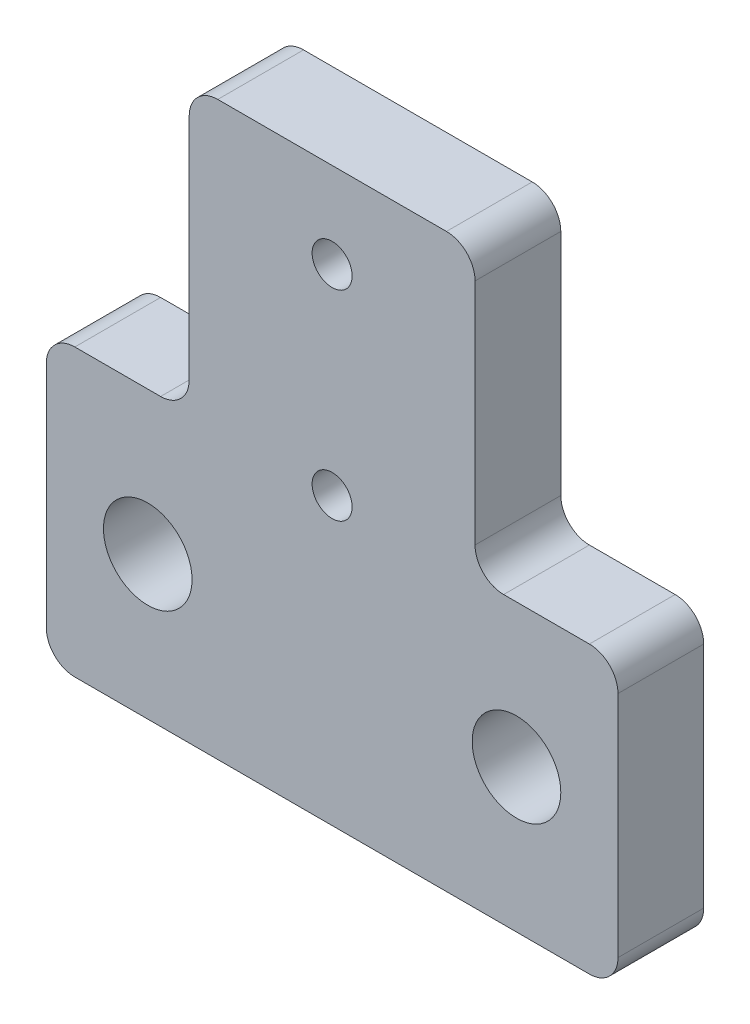
ISO-10303-21;
HEADER;
FILE_DESCRIPTION(('STEP AP214'),'2;1');
FILE_NAME('part.step','',(''),(''),'','','');
FILE_SCHEMA(('AUTOMOTIVE_DESIGN { 1 0 10303 214 1 1 1 1 }'));
ENDSEC;
DATA;
#1=APPLICATION_CONTEXT('core data for automotive mechanical design processes');
#2=APPLICATION_PROTOCOL_DEFINITION('international standard','automotive_design',2000,#1);
#3=PRODUCT_CONTEXT('',#1,'mechanical');
#4=PRODUCT('Part','Part','',(#3));
#5=PRODUCT_RELATED_PRODUCT_CATEGORY('part','',(#4));
#6=PRODUCT_DEFINITION_FORMATION('','',#4);
#7=PRODUCT_DEFINITION_CONTEXT('part definition',#1,'design');
#8=PRODUCT_DEFINITION('design','',#6,#7);
#9=PRODUCT_DEFINITION_SHAPE('','',#8);
#10=(LENGTH_UNIT() NAMED_UNIT(*) SI_UNIT(.MILLI.,.METRE.));
#11=(NAMED_UNIT(*) PLANE_ANGLE_UNIT() SI_UNIT($,.RADIAN.));
#12=(NAMED_UNIT(*) SI_UNIT($,.STERADIAN.) SOLID_ANGLE_UNIT());
#13=UNCERTAINTY_MEASURE_WITH_UNIT(LENGTH_MEASURE(1.E-05),#10,'distance_accuracy_value','');
#14=(GEOMETRIC_REPRESENTATION_CONTEXT(3) GLOBAL_UNCERTAINTY_ASSIGNED_CONTEXT((#13)) GLOBAL_UNIT_ASSIGNED_CONTEXT((#10,
#11,#12)) REPRESENTATION_CONTEXT('',''));
#15=CARTESIAN_POINT('',(0.,0.,0.));
#16=DIRECTION('',(0.,0.,1.));
#17=DIRECTION('',(1.,0.,0.));
#18=AXIS2_PLACEMENT_3D('',#15,#16,#17);
#19=CARTESIAN_POINT('',(0.,0.,3.));
#20=DIRECTION('',(0.,0.,-1.));
#21=DIRECTION('',(-1.,0.,0.));
#22=AXIS2_PLACEMENT_3D('',#19,#20,#21);
#23=PLANE('',#22);
#24=DIRECTION('',(0.,1.,0.));
#25=VECTOR('',#24,1.);
#26=CARTESIAN_POINT('',(10.,0.,3.));
#27=LINE('',#26,#25);
#28=CARTESIAN_POINT('',(10.,-9.,3.));
#29=VERTEX_POINT('',#28);
#30=CARTESIAN_POINT('',(10.,-1.,3.));
#31=VERTEX_POINT('',#30);
#32=EDGE_CURVE('E320',#29,#31,#27,.T.);
#33=ORIENTED_EDGE('',*,*,#32,.T.);
#34=CARTESIAN_POINT('',(9.,-1.,3.));
#35=DIRECTION('',(0.,0.,-1.));
#36=DIRECTION('',(-1.,0.,0.));
#37=AXIS2_PLACEMENT_3D('',#34,#35,#36);
#38=CIRCLE('',#37,1.);
#39=CARTESIAN_POINT('',(9.,0.,3.));
#40=VERTEX_POINT('',#39);
#41=EDGE_CURVE('E260',#31,#40,#38,.F.);
#42=ORIENTED_EDGE('',*,*,#41,.T.);
#43=DIRECTION('',(-1.,0.,0.));
#44=VECTOR('',#43,1.);
#45=CARTESIAN_POINT('',(5.,0.,3.));
#46=LINE('',#45,#44);
#47=CARTESIAN_POINT('',(6.,0.,3.));
#48=VERTEX_POINT('',#47);
#49=EDGE_CURVE('E308',#40,#48,#46,.T.);
#50=ORIENTED_EDGE('',*,*,#49,.T.);
#51=CARTESIAN_POINT('',(6.,0.999999999999997,3.));
#52=DIRECTION('',(0.,0.,-1.));
#53=DIRECTION('',(-1.,0.,0.));
#54=AXIS2_PLACEMENT_3D('',#51,#52,#53);
#55=CIRCLE('',#54,1.);
#56=CARTESIAN_POINT('',(5.,0.999999999999997,3.));
#57=VERTEX_POINT('',#56);
#58=EDGE_CURVE('E11',#48,#57,#55,.T.);
#59=ORIENTED_EDGE('',*,*,#58,.T.);
#60=DIRECTION('',(0.,1.,0.));
#61=VECTOR('',#60,1.);
#62=CARTESIAN_POINT('',(5.,10.,3.));
#63=LINE('',#62,#61);
#64=CARTESIAN_POINT('',(5.,9.,3.));
#65=VERTEX_POINT('',#64);
#66=EDGE_CURVE('E306',#57,#65,#63,.T.);
#67=ORIENTED_EDGE('',*,*,#66,.T.);
#68=CARTESIAN_POINT('',(4.,9.,3.));
#69=DIRECTION('',(0.,0.,-1.));
#70=DIRECTION('',(-1.,0.,0.));
#71=AXIS2_PLACEMENT_3D('',#68,#69,#70);
#72=CIRCLE('',#71,1.);
#73=CARTESIAN_POINT('',(4.,10.,3.));
#74=VERTEX_POINT('',#73);
#75=EDGE_CURVE('E249',#65,#74,#72,.F.);
#76=ORIENTED_EDGE('',*,*,#75,.T.);
#77=DIRECTION('',(-1.,0.,0.));
#78=VECTOR('',#77,1.);
#79=CARTESIAN_POINT('',(-5.,10.,3.));
#80=LINE('',#79,#78);
#81=CARTESIAN_POINT('',(-4.,10.,3.));
#82=VERTEX_POINT('',#81);
#83=EDGE_CURVE('E313',#74,#82,#80,.T.);
#84=ORIENTED_EDGE('',*,*,#83,.T.);
#85=CARTESIAN_POINT('',(-4.,9.,3.));
#86=DIRECTION('',(0.,0.,-1.));
#87=DIRECTION('',(-1.,0.,0.));
#88=AXIS2_PLACEMENT_3D('',#85,#86,#87);
#89=CIRCLE('',#88,1.);
#90=CARTESIAN_POINT('',(-5.,9.,3.));
#91=VERTEX_POINT('',#90);
#92=EDGE_CURVE('E246',#82,#91,#89,.F.);
#93=ORIENTED_EDGE('',*,*,#92,.T.);
#94=DIRECTION('',(0.,-1.,0.));
#95=VECTOR('',#94,1.);
#96=CARTESIAN_POINT('',(-5.,10.,3.));
#97=LINE('',#96,#95);
#98=CARTESIAN_POINT('',(-5.,0.999999999999997,3.));
#99=VERTEX_POINT('',#98);
#100=EDGE_CURVE('E318',#91,#99,#97,.T.);
#101=ORIENTED_EDGE('',*,*,#100,.T.);
#102=CARTESIAN_POINT('',(-6.,0.999999999999998,3.));
#103=DIRECTION('',(0.,0.,-1.));
#104=DIRECTION('',(-1.,0.,0.));
#105=AXIS2_PLACEMENT_3D('',#102,#103,#104);
#106=CIRCLE('',#105,1.);
#107=CARTESIAN_POINT('',(-6.,0.,3.));
#108=VERTEX_POINT('',#107);
#109=EDGE_CURVE('E165',#99,#108,#106,.T.);
#110=ORIENTED_EDGE('',*,*,#109,.T.);
#111=DIRECTION('',(-1.,0.,0.));
#112=VECTOR('',#111,1.);
#113=CARTESIAN_POINT('',(-5.,0.,3.));
#114=LINE('',#113,#112);
#115=CARTESIAN_POINT('',(-9.,0.,3.));
#116=VERTEX_POINT('',#115);
#117=EDGE_CURVE('E174',#108,#116,#114,.T.);
#118=ORIENTED_EDGE('',*,*,#117,.T.);
#119=CARTESIAN_POINT('',(-9.,-1.,3.));
#120=DIRECTION('',(0.,0.,-1.));
#121=DIRECTION('',(-1.,0.,0.));
#122=AXIS2_PLACEMENT_3D('',#119,#120,#121);
#123=CIRCLE('',#122,1.);
#124=CARTESIAN_POINT('',(-10.,-1.,3.));
#125=VERTEX_POINT('',#124);
#126=EDGE_CURVE('E62',#116,#125,#123,.F.);
#127=ORIENTED_EDGE('',*,*,#126,.T.);
#128=DIRECTION('',(0.,-1.,0.));
#129=VECTOR('',#128,1.);
#130=CARTESIAN_POINT('',(-10.,0.,3.));
#131=LINE('',#130,#129);
#132=CARTESIAN_POINT('',(-10.,-9.,3.));
#133=VERTEX_POINT('',#132);
#134=EDGE_CURVE('E201',#125,#133,#131,.T.);
#135=ORIENTED_EDGE('',*,*,#134,.T.);
#136=CARTESIAN_POINT('',(-9.,-9.,3.));
#137=DIRECTION('',(0.,0.,-1.));
#138=DIRECTION('',(-1.,0.,0.));
#139=AXIS2_PLACEMENT_3D('',#136,#137,#138);
#140=CIRCLE('',#139,1.);
#141=CARTESIAN_POINT('',(-9.,-10.,3.));
#142=VERTEX_POINT('',#141);
#143=EDGE_CURVE('E254',#133,#142,#140,.F.);
#144=ORIENTED_EDGE('',*,*,#143,.T.);
#145=DIRECTION('',(1.,0.,0.));
#146=VECTOR('',#145,1.);
#147=CARTESIAN_POINT('',(5.,-10.,3.));
#148=LINE('',#147,#146);
#149=CARTESIAN_POINT('',(9.,-10.,3.));
#150=VERTEX_POINT('',#149);
#151=EDGE_CURVE('E199',#142,#150,#148,.T.);
#152=ORIENTED_EDGE('',*,*,#151,.T.);
#153=CARTESIAN_POINT('',(9.,-9.,3.));
#154=DIRECTION('',(0.,0.,-1.));
#155=DIRECTION('',(-1.,0.,0.));
#156=AXIS2_PLACEMENT_3D('',#153,#154,#155);
#157=CIRCLE('',#156,1.);
#158=EDGE_CURVE('E257',#150,#29,#157,.F.);
#159=ORIENTED_EDGE('',*,*,#158,.T.);
#160=EDGE_LOOP('',(#33,#42,#50,#59,#67,#76,#84,#93,#101,#110,#118,#127,#135,#144,#152,#159));
#161=FACE_BOUND('',#160,.T.);
#162=CARTESIAN_POINT('',(-6.45,-5.,3.));
#163=DIRECTION('',(0.,0.,1.));
#164=DIRECTION('',(1.,0.,0.));
#165=AXIS2_PLACEMENT_3D('',#162,#163,#164);
#166=CIRCLE('',#165,1.55);
#167=CARTESIAN_POINT('',(-4.9,-5.,3.));
#168=VERTEX_POINT('',#167);
#169=EDGE_CURVE('E333',#168,#168,#166,.T.);
#170=ORIENTED_EDGE('',*,*,#169,.F.);
#171=EDGE_LOOP('',(#170));
#172=FACE_BOUND('',#171,.T.);
#173=CARTESIAN_POINT('',(6.44999999999999,-5.,3.));
#174=DIRECTION('',(0.,0.,1.));
#175=DIRECTION('',(1.,0.,0.));
#176=AXIS2_PLACEMENT_3D('',#173,#174,#175);
#177=CIRCLE('',#176,1.55);
#178=CARTESIAN_POINT('',(7.99999999999999,-5.,3.));
#179=VERTEX_POINT('',#178);
#180=EDGE_CURVE('E396',#179,#179,#177,.T.);
#181=ORIENTED_EDGE('',*,*,#180,.F.);
#182=EDGE_LOOP('',(#181));
#183=FACE_BOUND('',#182,.T.);
#184=CARTESIAN_POINT('',(0.,0.,3.));
#185=DIRECTION('',(0.,0.,1.));
#186=DIRECTION('',(1.,0.,0.));
#187=AXIS2_PLACEMENT_3D('',#184,#185,#186);
#188=CIRCLE('',#187,0.7);
#189=CARTESIAN_POINT('',(0.700000000000001,0.,3.));
#190=VERTEX_POINT('',#189);
#191=EDGE_CURVE('E404',#190,#190,#188,.T.);
#192=ORIENTED_EDGE('',*,*,#191,.F.);
#193=EDGE_LOOP('',(#192));
#194=FACE_BOUND('',#193,.T.);
#195=CARTESIAN_POINT('',(0.,7.,3.));
#196=DIRECTION('',(0.,0.,1.));
#197=DIRECTION('',(1.,0.,0.));
#198=AXIS2_PLACEMENT_3D('',#195,#196,#197);
#199=CIRCLE('',#198,0.7);
#200=CARTESIAN_POINT('',(0.7,7.,3.));
#201=VERTEX_POINT('',#200);
#202=EDGE_CURVE('E412',#201,#201,#199,.T.);
#203=ORIENTED_EDGE('',*,*,#202,.F.);
#204=EDGE_LOOP('',(#203));
#205=FACE_BOUND('',#204,.T.);
#206=ADVANCED_FACE('F39',(#161,#172,#183,#194,#205),#23,.F.);
#207=CARTESIAN_POINT('',(0.,0.,0.));
#208=DIRECTION('',(0.,0.,-1.));
#209=DIRECTION('',(-1.,0.,0.));
#210=AXIS2_PLACEMENT_3D('',#207,#208,#209);
#211=PLANE('',#210);
#212=CARTESIAN_POINT('',(0.,0.,0.));
#213=DIRECTION('',(0.,0.,1.));
#214=DIRECTION('',(1.,0.,0.));
#215=AXIS2_PLACEMENT_3D('',#212,#213,#214);
#216=CIRCLE('',#215,0.7);
#217=CARTESIAN_POINT('',(0.700000000000001,0.,0.));
#218=VERTEX_POINT('',#217);
#219=EDGE_CURVE('E408',#218,#218,#216,.T.);
#220=ORIENTED_EDGE('',*,*,#219,.T.);
#221=EDGE_LOOP('',(#220));
#222=FACE_BOUND('',#221,.T.);
#223=CARTESIAN_POINT('',(-6.45,-5.,0.));
#224=DIRECTION('',(0.,0.,1.));
#225=DIRECTION('',(1.,0.,0.));
#226=AXIS2_PLACEMENT_3D('',#223,#224,#225);
#227=CIRCLE('',#226,1.55);
#228=CARTESIAN_POINT('',(-4.9,-5.,0.));
#229=VERTEX_POINT('',#228);
#230=EDGE_CURVE('E392',#229,#229,#227,.T.);
#231=ORIENTED_EDGE('',*,*,#230,.T.);
#232=EDGE_LOOP('',(#231));
#233=FACE_BOUND('',#232,.T.);
#234=DIRECTION('',(-1.,0.,0.));
#235=VECTOR('',#234,1.);
#236=CARTESIAN_POINT('',(5.,0.,0.));
#237=LINE('',#236,#235);
#238=CARTESIAN_POINT('',(9.,0.,0.));
#239=VERTEX_POINT('',#238);
#240=CARTESIAN_POINT('',(6.,0.,0.));
#241=VERTEX_POINT('',#240);
#242=EDGE_CURVE('E286',#239,#241,#237,.T.);
#243=ORIENTED_EDGE('',*,*,#242,.F.);
#244=CARTESIAN_POINT('',(9.,-1.,0.));
#245=DIRECTION('',(0.,0.,-1.));
#246=DIRECTION('',(-1.,0.,0.));
#247=AXIS2_PLACEMENT_3D('',#244,#245,#246);
#248=CIRCLE('',#247,1.);
#249=CARTESIAN_POINT('',(10.,-1.,0.));
#250=VERTEX_POINT('',#249);
#251=EDGE_CURVE('E236',#239,#250,#248,.T.);
#252=ORIENTED_EDGE('',*,*,#251,.T.);
#253=DIRECTION('',(0.,1.,0.));
#254=VECTOR('',#253,1.);
#255=CARTESIAN_POINT('',(10.,0.,0.));
#256=LINE('',#255,#254);
#257=CARTESIAN_POINT('',(10.,-9.,0.));
#258=VERTEX_POINT('',#257);
#259=EDGE_CURVE('E298',#258,#250,#256,.T.);
#260=ORIENTED_EDGE('',*,*,#259,.F.);
#261=CARTESIAN_POINT('',(9.,-9.,0.));
#262=DIRECTION('',(0.,0.,-1.));
#263=DIRECTION('',(-1.,0.,0.));
#264=AXIS2_PLACEMENT_3D('',#261,#262,#263);
#265=CIRCLE('',#264,1.);
#266=CARTESIAN_POINT('',(9.,-10.,0.));
#267=VERTEX_POINT('',#266);
#268=EDGE_CURVE('E233',#258,#267,#265,.T.);
#269=ORIENTED_EDGE('',*,*,#268,.T.);
#270=DIRECTION('',(1.,0.,0.));
#271=VECTOR('',#270,1.);
#272=CARTESIAN_POINT('',(-5.,-10.,0.));
#273=LINE('',#272,#271);
#274=CARTESIAN_POINT('',(-9.,-10.,0.));
#275=VERTEX_POINT('',#274);
#276=EDGE_CURVE('E190',#275,#267,#273,.T.);
#277=ORIENTED_EDGE('',*,*,#276,.F.);
#278=CARTESIAN_POINT('',(-9.,-9.,0.));
#279=DIRECTION('',(0.,0.,-1.));
#280=DIRECTION('',(-1.,0.,0.));
#281=AXIS2_PLACEMENT_3D('',#278,#279,#280);
#282=CIRCLE('',#281,1.);
#283=CARTESIAN_POINT('',(-10.,-9.,0.));
#284=VERTEX_POINT('',#283);
#285=EDGE_CURVE('E230',#275,#284,#282,.T.);
#286=ORIENTED_EDGE('',*,*,#285,.T.);
#287=DIRECTION('',(0.,-1.,0.));
#288=VECTOR('',#287,1.);
#289=CARTESIAN_POINT('',(-10.,0.,0.));
#290=LINE('',#289,#288);
#291=CARTESIAN_POINT('',(-10.,-1.,0.));
#292=VERTEX_POINT('',#291);
#293=EDGE_CURVE('E185',#292,#284,#290,.T.);
#294=ORIENTED_EDGE('',*,*,#293,.F.);
#295=CARTESIAN_POINT('',(-9.,-1.,0.));
#296=DIRECTION('',(0.,0.,-1.));
#297=DIRECTION('',(-1.,0.,0.));
#298=AXIS2_PLACEMENT_3D('',#295,#296,#297);
#299=CIRCLE('',#298,1.);
#300=CARTESIAN_POINT('',(-9.,0.,0.));
#301=VERTEX_POINT('',#300);
#302=EDGE_CURVE('E183',#292,#301,#299,.T.);
#303=ORIENTED_EDGE('',*,*,#302,.T.);
#304=DIRECTION('',(-1.,0.,0.));
#305=VECTOR('',#304,1.);
#306=CARTESIAN_POINT('',(-5.,0.,0.));
#307=LINE('',#306,#305);
#308=CARTESIAN_POINT('',(-6.,0.,0.));
#309=VERTEX_POINT('',#308);
#310=EDGE_CURVE('E172',#309,#301,#307,.T.);
#311=ORIENTED_EDGE('',*,*,#310,.F.);
#312=CARTESIAN_POINT('',(-6.,0.999999999999998,0.));
#313=DIRECTION('',(0.,0.,-1.));
#314=DIRECTION('',(-1.,0.,0.));
#315=AXIS2_PLACEMENT_3D('',#312,#313,#314);
#316=CIRCLE('',#315,1.);
#317=CARTESIAN_POINT('',(-5.,0.999999999999997,0.));
#318=VERTEX_POINT('',#317);
#319=EDGE_CURVE('E154',#309,#318,#316,.F.);
#320=ORIENTED_EDGE('',*,*,#319,.T.);
#321=DIRECTION('',(0.,-1.,0.));
#322=VECTOR('',#321,1.);
#323=CARTESIAN_POINT('',(-5.,10.,0.));
#324=LINE('',#323,#322);
#325=CARTESIAN_POINT('',(-5.,9.,0.));
#326=VERTEX_POINT('',#325);
#327=EDGE_CURVE('E186',#326,#318,#324,.T.);
#328=ORIENTED_EDGE('',*,*,#327,.F.);
#329=CARTESIAN_POINT('',(-4.,9.,0.));
#330=DIRECTION('',(0.,0.,-1.));
#331=DIRECTION('',(-1.,0.,0.));
#332=AXIS2_PLACEMENT_3D('',#329,#330,#331);
#333=CIRCLE('',#332,1.);
#334=CARTESIAN_POINT('',(-4.,10.,0.));
#335=VERTEX_POINT('',#334);
#336=EDGE_CURVE('E222',#326,#335,#333,.T.);
#337=ORIENTED_EDGE('',*,*,#336,.T.);
#338=DIRECTION('',(-1.,0.,0.));
#339=VECTOR('',#338,1.);
#340=CARTESIAN_POINT('',(-5.,10.,0.));
#341=LINE('',#340,#339);
#342=CARTESIAN_POINT('',(4.,10.,0.));
#343=VERTEX_POINT('',#342);
#344=EDGE_CURVE('E192',#343,#335,#341,.T.);
#345=ORIENTED_EDGE('',*,*,#344,.F.);
#346=CARTESIAN_POINT('',(4.,9.,0.));
#347=DIRECTION('',(0.,0.,-1.));
#348=DIRECTION('',(-1.,0.,0.));
#349=AXIS2_PLACEMENT_3D('',#346,#347,#348);
#350=CIRCLE('',#349,1.);
#351=CARTESIAN_POINT('',(5.,9.,0.));
#352=VERTEX_POINT('',#351);
#353=EDGE_CURVE('E225',#343,#352,#350,.T.);
#354=ORIENTED_EDGE('',*,*,#353,.T.);
#355=DIRECTION('',(0.,1.,0.));
#356=VECTOR('',#355,1.);
#357=CARTESIAN_POINT('',(5.,10.,0.));
#358=LINE('',#357,#356);
#359=CARTESIAN_POINT('',(5.,0.999999999999997,0.));
#360=VERTEX_POINT('',#359);
#361=EDGE_CURVE('E288',#360,#352,#358,.T.);
#362=ORIENTED_EDGE('',*,*,#361,.F.);
#363=CARTESIAN_POINT('',(6.,0.999999999999997,0.));
#364=DIRECTION('',(0.,0.,-1.));
#365=DIRECTION('',(-1.,0.,0.));
#366=AXIS2_PLACEMENT_3D('',#363,#364,#365);
#367=CIRCLE('',#366,1.);
#368=EDGE_CURVE('E48',#360,#241,#367,.F.);
#369=ORIENTED_EDGE('',*,*,#368,.T.);
#370=EDGE_LOOP('',(#243,#252,#260,#269,#277,#286,#294,#303,#311,#320,#328,#337,#345,#354,#362,#369));
#371=FACE_BOUND('',#370,.T.);
#372=CARTESIAN_POINT('',(6.44999999999999,-5.,0.));
#373=DIRECTION('',(0.,0.,1.));
#374=DIRECTION('',(1.,0.,0.));
#375=AXIS2_PLACEMENT_3D('',#372,#373,#374);
#376=CIRCLE('',#375,1.55);
#377=CARTESIAN_POINT('',(7.99999999999999,-5.,0.));
#378=VERTEX_POINT('',#377);
#379=EDGE_CURVE('E400',#378,#378,#376,.T.);
#380=ORIENTED_EDGE('',*,*,#379,.T.);
#381=EDGE_LOOP('',(#380));
#382=FACE_BOUND('',#381,.T.);
#383=CARTESIAN_POINT('',(0.,7.,0.));
#384=DIRECTION('',(0.,0.,1.));
#385=DIRECTION('',(1.,0.,0.));
#386=AXIS2_PLACEMENT_3D('',#383,#384,#385);
#387=CIRCLE('',#386,0.7);
#388=CARTESIAN_POINT('',(0.7,7.,0.));
#389=VERTEX_POINT('',#388);
#390=EDGE_CURVE('E416',#389,#389,#387,.T.);
#391=ORIENTED_EDGE('',*,*,#390,.T.);
#392=EDGE_LOOP('',(#391));
#393=FACE_BOUND('',#392,.T.);
#394=ADVANCED_FACE('F180',(#222,#233,#371,#382,#393),#211,.T.);
#395=CARTESIAN_POINT('',(10.,0.,3.));
#396=DIRECTION('',(-1.,0.,0.));
#397=DIRECTION('',(0.,-1.,0.));
#398=AXIS2_PLACEMENT_3D('',#395,#396,#397);
#399=PLANE('',#398);
#400=ORIENTED_EDGE('',*,*,#259,.T.);
#401=DIRECTION('',(0.,0.,-1.));
#402=VECTOR('',#401,1.);
#403=CARTESIAN_POINT('',(10.,-1.,3.));
#404=LINE('',#403,#402);
#405=EDGE_CURVE('E243',#250,#31,#404,.F.);
#406=ORIENTED_EDGE('',*,*,#405,.T.);
#407=ORIENTED_EDGE('',*,*,#32,.F.);
#408=DIRECTION('',(0.,0.,-1.));
#409=VECTOR('',#408,1.);
#410=CARTESIAN_POINT('',(10.,-9.,3.));
#411=LINE('',#410,#409);
#412=EDGE_CURVE('E239',#29,#258,#411,.T.);
#413=ORIENTED_EDGE('',*,*,#412,.T.);
#414=EDGE_LOOP('',(#400,#406,#407,#413));
#415=FACE_BOUND('',#414,.T.);
#416=ADVANCED_FACE('F364',(#415),#399,.F.);
#417=CARTESIAN_POINT('',(5.,0.,3.));
#418=DIRECTION('',(0.,-1.,0.));
#419=DIRECTION('',(0.,0.,-1.));
#420=AXIS2_PLACEMENT_3D('',#417,#418,#419);
#421=PLANE('',#420);
#422=ORIENTED_EDGE('',*,*,#242,.T.);
#423=DIRECTION('',(0.,0.,-1.));
#424=VECTOR('',#423,1.);
#425=CARTESIAN_POINT('',(6.,0.,3.));
#426=LINE('',#425,#424);
#427=EDGE_CURVE('E219',#241,#48,#426,.F.);
#428=ORIENTED_EDGE('',*,*,#427,.T.);
#429=ORIENTED_EDGE('',*,*,#49,.F.);
#430=DIRECTION('',(0.,0.,-1.));
#431=VECTOR('',#430,1.);
#432=CARTESIAN_POINT('',(9.,0.,3.));
#433=LINE('',#432,#431);
#434=EDGE_CURVE('E215',#40,#239,#433,.T.);
#435=ORIENTED_EDGE('',*,*,#434,.T.);
#436=EDGE_LOOP('',(#422,#428,#429,#435));
#437=FACE_BOUND('',#436,.T.);
#438=ADVANCED_FACE('F293',(#437),#421,.F.);
#439=CARTESIAN_POINT('',(5.,10.,3.));
#440=DIRECTION('',(-1.,0.,0.));
#441=DIRECTION('',(0.,-1.,0.));
#442=AXIS2_PLACEMENT_3D('',#439,#440,#441);
#443=PLANE('',#442);
#444=ORIENTED_EDGE('',*,*,#66,.F.);
#445=DIRECTION('',(0.,0.,-1.));
#446=VECTOR('',#445,1.);
#447=CARTESIAN_POINT('',(5.,0.999999999999997,0.));
#448=LINE('',#447,#446);
#449=EDGE_CURVE('E211',#57,#360,#448,.T.);
#450=ORIENTED_EDGE('',*,*,#449,.T.);
#451=ORIENTED_EDGE('',*,*,#361,.T.);
#452=DIRECTION('',(0.,0.,-1.));
#453=VECTOR('',#452,1.);
#454=CARTESIAN_POINT('',(5.,9.,3.));
#455=LINE('',#454,#453);
#456=EDGE_CURVE('E208',#352,#65,#455,.F.);
#457=ORIENTED_EDGE('',*,*,#456,.T.);
#458=EDGE_LOOP('',(#444,#450,#451,#457));
#459=FACE_BOUND('',#458,.T.);
#460=ADVANCED_FACE('F310',(#459),#443,.F.);
#461=CARTESIAN_POINT('',(-5.,10.,3.));
#462=DIRECTION('',(0.,-1.,0.));
#463=DIRECTION('',(0.,0.,-1.));
#464=AXIS2_PLACEMENT_3D('',#461,#462,#463);
#465=PLANE('',#464);
#466=ORIENTED_EDGE('',*,*,#83,.F.);
#467=DIRECTION('',(0.,0.,-1.));
#468=VECTOR('',#467,1.);
#469=CARTESIAN_POINT('',(4.,10.,3.));
#470=LINE('',#469,#468);
#471=EDGE_CURVE('E166',#74,#343,#470,.T.);
#472=ORIENTED_EDGE('',*,*,#471,.T.);
#473=ORIENTED_EDGE('',*,*,#344,.T.);
#474=DIRECTION('',(0.,0.,-1.));
#475=VECTOR('',#474,1.);
#476=CARTESIAN_POINT('',(-4.,10.,3.));
#477=LINE('',#476,#475);
#478=EDGE_CURVE('E276',#335,#82,#477,.F.);
#479=ORIENTED_EDGE('',*,*,#478,.T.);
#480=EDGE_LOOP('',(#466,#472,#473,#479));
#481=FACE_BOUND('',#480,.T.);
#482=ADVANCED_FACE('F342',(#481),#465,.F.);
#483=CARTESIAN_POINT('',(-5.,10.,3.));
#484=DIRECTION('',(1.,0.,0.));
#485=DIRECTION('',(0.,1.,0.));
#486=AXIS2_PLACEMENT_3D('',#483,#484,#485);
#487=PLANE('',#486);
#488=ORIENTED_EDGE('',*,*,#327,.T.);
#489=DIRECTION('',(0.,0.,-1.));
#490=VECTOR('',#489,1.);
#491=CARTESIAN_POINT('',(-5.,0.999999999999998,3.));
#492=LINE('',#491,#490);
#493=EDGE_CURVE('E159',#318,#99,#492,.F.);
#494=ORIENTED_EDGE('',*,*,#493,.T.);
#495=ORIENTED_EDGE('',*,*,#100,.F.);
#496=DIRECTION('',(0.,0.,-1.));
#497=VECTOR('',#496,1.);
#498=CARTESIAN_POINT('',(-5.,9.,3.));
#499=LINE('',#498,#497);
#500=EDGE_CURVE('E176',#91,#326,#499,.T.);
#501=ORIENTED_EDGE('',*,*,#500,.T.);
#502=EDGE_LOOP('',(#488,#494,#495,#501));
#503=FACE_BOUND('',#502,.T.);
#504=ADVANCED_FACE('F349',(#503),#487,.F.);
#505=CARTESIAN_POINT('',(-5.,0.,3.));
#506=DIRECTION('',(0.,-1.,0.));
#507=DIRECTION('',(1.,0.,0.));
#508=AXIS2_PLACEMENT_3D('',#505,#506,#507);
#509=PLANE('',#508);
#510=ORIENTED_EDGE('',*,*,#117,.F.);
#511=DIRECTION('',(0.,0.,-1.));
#512=VECTOR('',#511,1.);
#513=CARTESIAN_POINT('',(-6.,0.,0.));
#514=LINE('',#513,#512);
#515=EDGE_CURVE('E158',#108,#309,#514,.T.);
#516=ORIENTED_EDGE('',*,*,#515,.T.);
#517=ORIENTED_EDGE('',*,*,#310,.T.);
#518=DIRECTION('',(0.,0.,-1.));
#519=VECTOR('',#518,1.);
#520=CARTESIAN_POINT('',(-9.,0.,3.));
#521=LINE('',#520,#519);
#522=EDGE_CURVE('E177',#301,#116,#521,.F.);
#523=ORIENTED_EDGE('',*,*,#522,.T.);
#524=EDGE_LOOP('',(#510,#516,#517,#523));
#525=FACE_BOUND('',#524,.T.);
#526=ADVANCED_FACE('F171',(#525),#509,.F.);
#527=CARTESIAN_POINT('',(-10.,0.,3.));
#528=DIRECTION('',(1.,0.,0.));
#529=DIRECTION('',(0.,1.,0.));
#530=AXIS2_PLACEMENT_3D('',#527,#528,#529);
#531=PLANE('',#530);
#532=ORIENTED_EDGE('',*,*,#293,.T.);
#533=DIRECTION('',(0.,0.,-1.));
#534=VECTOR('',#533,1.);
#535=CARTESIAN_POINT('',(-10.,-9.,3.));
#536=LINE('',#535,#534);
#537=EDGE_CURVE('E55',#284,#133,#536,.F.);
#538=ORIENTED_EDGE('',*,*,#537,.T.);
#539=ORIENTED_EDGE('',*,*,#134,.F.);
#540=DIRECTION('',(0.,0.,-1.));
#541=VECTOR('',#540,1.);
#542=CARTESIAN_POINT('',(-10.,-1.,3.));
#543=LINE('',#542,#541);
#544=EDGE_CURVE('E270',#125,#292,#543,.T.);
#545=ORIENTED_EDGE('',*,*,#544,.T.);
#546=EDGE_LOOP('',(#532,#538,#539,#545));
#547=FACE_BOUND('',#546,.T.);
#548=ADVANCED_FACE('F356',(#547),#531,.F.);
#549=CARTESIAN_POINT('',(-5.,-10.,3.));
#550=DIRECTION('',(0.,1.,0.));
#551=DIRECTION('',(0.,0.,1.));
#552=AXIS2_PLACEMENT_3D('',#549,#550,#551);
#553=PLANE('',#552);
#554=ORIENTED_EDGE('',*,*,#276,.T.);
#555=DIRECTION('',(0.,0.,-1.));
#556=VECTOR('',#555,1.);
#557=CARTESIAN_POINT('',(9.,-10.,3.));
#558=LINE('',#557,#556);
#559=EDGE_CURVE('E267',#267,#150,#558,.F.);
#560=ORIENTED_EDGE('',*,*,#559,.T.);
#561=ORIENTED_EDGE('',*,*,#151,.F.);
#562=DIRECTION('',(0.,0.,-1.));
#563=VECTOR('',#562,1.);
#564=CARTESIAN_POINT('',(-9.,-10.,3.));
#565=LINE('',#564,#563);
#566=EDGE_CURVE('E263',#142,#275,#565,.T.);
#567=ORIENTED_EDGE('',*,*,#566,.T.);
#568=EDGE_LOOP('',(#554,#560,#561,#567));
#569=FACE_BOUND('',#568,.T.);
#570=ADVANCED_FACE('F371',(#569),#553,.F.);
#571=CARTESIAN_POINT('',(-6.45,-5.,3.));
#572=DIRECTION('',(0.,0.,-1.));
#573=DIRECTION('',(-1.,0.,0.));
#574=AXIS2_PLACEMENT_3D('',#571,#572,#573);
#575=CYLINDRICAL_SURFACE('',#574,1.55);
#576=ORIENTED_EDGE('',*,*,#169,.T.);
#577=EDGE_LOOP('',(#576));
#578=FACE_BOUND('',#577,.T.);
#579=ORIENTED_EDGE('',*,*,#230,.F.);
#580=EDGE_LOOP('',(#579));
#581=FACE_BOUND('',#580,.T.);
#582=ADVANCED_FACE('F368',(#578,#581),#575,.F.);
#583=CARTESIAN_POINT('',(6.44999999999999,-5.,3.));
#584=DIRECTION('',(0.,0.,-1.));
#585=DIRECTION('',(-1.,0.,0.));
#586=AXIS2_PLACEMENT_3D('',#583,#584,#585);
#587=CYLINDRICAL_SURFACE('',#586,1.55);
#588=ORIENTED_EDGE('',*,*,#180,.T.);
#589=EDGE_LOOP('',(#588));
#590=FACE_BOUND('',#589,.T.);
#591=ORIENTED_EDGE('',*,*,#379,.F.);
#592=EDGE_LOOP('',(#591));
#593=FACE_BOUND('',#592,.T.);
#594=ADVANCED_FACE('F437',(#590,#593),#587,.F.);
#595=CARTESIAN_POINT('',(0.,0.,3.));
#596=DIRECTION('',(0.,0.,-1.));
#597=DIRECTION('',(-1.,0.,0.));
#598=AXIS2_PLACEMENT_3D('',#595,#596,#597);
#599=CYLINDRICAL_SURFACE('',#598,0.7);
#600=ORIENTED_EDGE('',*,*,#191,.T.);
#601=EDGE_LOOP('',(#600));
#602=FACE_BOUND('',#601,.T.);
#603=ORIENTED_EDGE('',*,*,#219,.F.);
#604=EDGE_LOOP('',(#603));
#605=FACE_BOUND('',#604,.T.);
#606=ADVANCED_FACE('F428',(#602,#605),#599,.F.);
#607=CARTESIAN_POINT('',(0.,7.,3.));
#608=DIRECTION('',(0.,0.,-1.));
#609=DIRECTION('',(-1.,0.,0.));
#610=AXIS2_PLACEMENT_3D('',#607,#608,#609);
#611=CYLINDRICAL_SURFACE('',#610,0.7);
#612=ORIENTED_EDGE('',*,*,#202,.T.);
#613=EDGE_LOOP('',(#612));
#614=FACE_BOUND('',#613,.T.);
#615=ORIENTED_EDGE('',*,*,#390,.F.);
#616=EDGE_LOOP('',(#615));
#617=FACE_BOUND('',#616,.T.);
#618=ADVANCED_FACE('F424',(#614,#617),#611,.F.);
#619=CARTESIAN_POINT('',(-6.,0.999999999999998,3.));
#620=DIRECTION('',(0.,0.,1.));
#621=DIRECTION('',(1.,0.,0.));
#622=AXIS2_PLACEMENT_3D('',#619,#620,#621);
#623=CYLINDRICAL_SURFACE('',#622,1.);
#624=ORIENTED_EDGE('',*,*,#109,.F.);
#625=ORIENTED_EDGE('',*,*,#493,.F.);
#626=ORIENTED_EDGE('',*,*,#319,.F.);
#627=ORIENTED_EDGE('',*,*,#515,.F.);
#628=EDGE_LOOP('',(#624,#625,#626,#627));
#629=FACE_BOUND('',#628,.T.);
#630=ADVANCED_FACE('F157',(#629),#623,.F.);
#631=CARTESIAN_POINT('',(6.,0.999999999999997,3.));
#632=DIRECTION('',(0.,0.,1.));
#633=DIRECTION('',(1.,0.,0.));
#634=AXIS2_PLACEMENT_3D('',#631,#632,#633);
#635=CYLINDRICAL_SURFACE('',#634,1.);
#636=ORIENTED_EDGE('',*,*,#58,.F.);
#637=ORIENTED_EDGE('',*,*,#427,.F.);
#638=ORIENTED_EDGE('',*,*,#368,.F.);
#639=ORIENTED_EDGE('',*,*,#449,.F.);
#640=EDGE_LOOP('',(#636,#637,#638,#639));
#641=FACE_BOUND('',#640,.T.);
#642=ADVANCED_FACE('F301',(#641),#635,.F.);
#643=CARTESIAN_POINT('',(9.,-1.,3.));
#644=DIRECTION('',(0.,0.,-1.));
#645=DIRECTION('',(-1.,0.,0.));
#646=AXIS2_PLACEMENT_3D('',#643,#644,#645);
#647=CYLINDRICAL_SURFACE('',#646,1.);
#648=ORIENTED_EDGE('',*,*,#41,.F.);
#649=ORIENTED_EDGE('',*,*,#405,.F.);
#650=ORIENTED_EDGE('',*,*,#251,.F.);
#651=ORIENTED_EDGE('',*,*,#434,.F.);
#652=EDGE_LOOP('',(#648,#649,#650,#651));
#653=FACE_BOUND('',#652,.T.);
#654=ADVANCED_FACE('F484',(#653),#647,.T.);
#655=CARTESIAN_POINT('',(9.,-9.,3.));
#656=DIRECTION('',(0.,0.,-1.));
#657=DIRECTION('',(-1.,0.,0.));
#658=AXIS2_PLACEMENT_3D('',#655,#656,#657);
#659=CYLINDRICAL_SURFACE('',#658,1.);
#660=ORIENTED_EDGE('',*,*,#158,.F.);
#661=ORIENTED_EDGE('',*,*,#559,.F.);
#662=ORIENTED_EDGE('',*,*,#268,.F.);
#663=ORIENTED_EDGE('',*,*,#412,.F.);
#664=EDGE_LOOP('',(#660,#661,#662,#663));
#665=FACE_BOUND('',#664,.T.);
#666=ADVANCED_FACE('F493',(#665),#659,.T.);
#667=CARTESIAN_POINT('',(-9.,-9.,3.));
#668=DIRECTION('',(0.,0.,-1.));
#669=DIRECTION('',(-1.,0.,0.));
#670=AXIS2_PLACEMENT_3D('',#667,#668,#669);
#671=CYLINDRICAL_SURFACE('',#670,1.);
#672=ORIENTED_EDGE('',*,*,#143,.F.);
#673=ORIENTED_EDGE('',*,*,#537,.F.);
#674=ORIENTED_EDGE('',*,*,#285,.F.);
#675=ORIENTED_EDGE('',*,*,#566,.F.);
#676=EDGE_LOOP('',(#672,#673,#674,#675));
#677=FACE_BOUND('',#676,.T.);
#678=ADVANCED_FACE('F381',(#677),#671,.T.);
#679=CARTESIAN_POINT('',(-9.,-1.,3.));
#680=DIRECTION('',(0.,0.,-1.));
#681=DIRECTION('',(-1.,0.,0.));
#682=AXIS2_PLACEMENT_3D('',#679,#680,#681);
#683=CYLINDRICAL_SURFACE('',#682,1.);
#684=ORIENTED_EDGE('',*,*,#126,.F.);
#685=ORIENTED_EDGE('',*,*,#522,.F.);
#686=ORIENTED_EDGE('',*,*,#302,.F.);
#687=ORIENTED_EDGE('',*,*,#544,.F.);
#688=EDGE_LOOP('',(#684,#685,#686,#687));
#689=FACE_BOUND('',#688,.T.);
#690=ADVANCED_FACE('F512',(#689),#683,.T.);
#691=CARTESIAN_POINT('',(4.,9.,3.));
#692=DIRECTION('',(0.,0.,-1.));
#693=DIRECTION('',(-1.,0.,0.));
#694=AXIS2_PLACEMENT_3D('',#691,#692,#693);
#695=CYLINDRICAL_SURFACE('',#694,1.);
#696=ORIENTED_EDGE('',*,*,#75,.F.);
#697=ORIENTED_EDGE('',*,*,#456,.F.);
#698=ORIENTED_EDGE('',*,*,#353,.F.);
#699=ORIENTED_EDGE('',*,*,#471,.F.);
#700=EDGE_LOOP('',(#696,#697,#698,#699));
#701=FACE_BOUND('',#700,.T.);
#702=ADVANCED_FACE('F521',(#701),#695,.T.);
#703=CARTESIAN_POINT('',(-4.,9.,3.));
#704=DIRECTION('',(0.,0.,-1.));
#705=DIRECTION('',(-1.,0.,0.));
#706=AXIS2_PLACEMENT_3D('',#703,#704,#705);
#707=CYLINDRICAL_SURFACE('',#706,1.);
#708=ORIENTED_EDGE('',*,*,#92,.F.);
#709=ORIENTED_EDGE('',*,*,#478,.F.);
#710=ORIENTED_EDGE('',*,*,#336,.F.);
#711=ORIENTED_EDGE('',*,*,#500,.F.);
#712=EDGE_LOOP('',(#708,#709,#710,#711));
#713=FACE_BOUND('',#712,.T.);
#714=ADVANCED_FACE('F41',(#713),#707,.T.);
#715=CLOSED_SHELL('',(#206,#394,#416,#438,#460,#482,#504,#526,#548,#570,#582,#594,#606,#618,
#630,#642,#654,#666,#678,#690,#702,#714));
#716=MANIFOLD_SOLID_BREP('B2',#715);
#717=ADVANCED_BREP_SHAPE_REPRESENTATION('',(#18,#716),#14);
#718=SHAPE_DEFINITION_REPRESENTATION(#9,#717);
ENDSEC;
END-ISO-10303-21;
